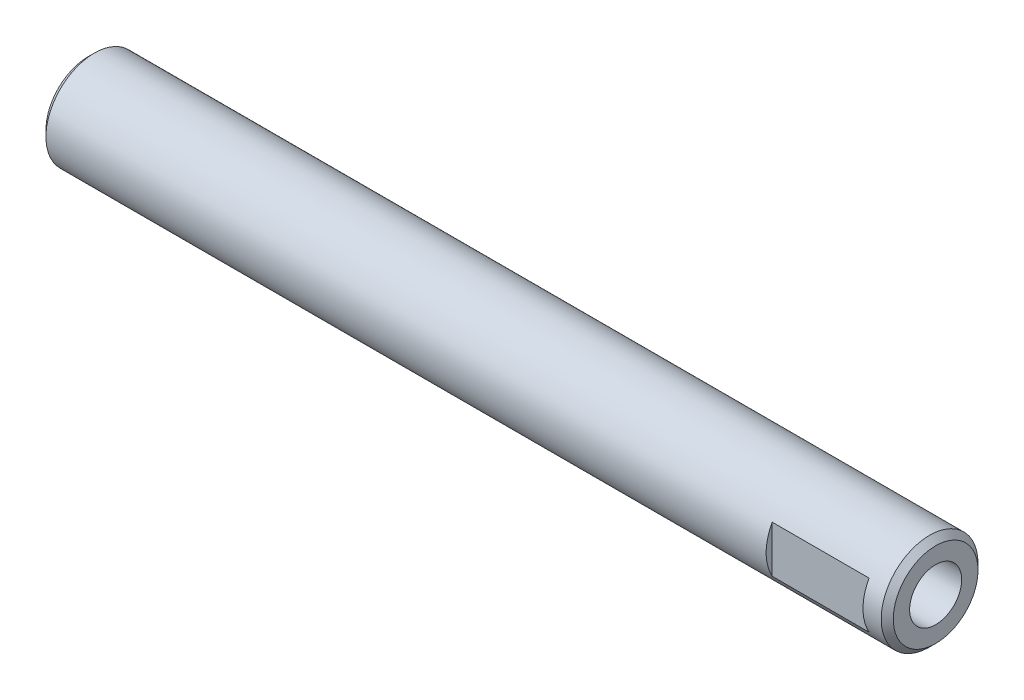
ISO-10303-21;
HEADER;
FILE_DESCRIPTION(('STEP AP214'),'2;1');
FILE_NAME('part.step','',(''),(''),'','','');
FILE_SCHEMA(('AUTOMOTIVE_DESIGN { 1 0 10303 214 1 1 1 1 }'));
ENDSEC;
DATA;
#1=APPLICATION_CONTEXT('core data for automotive mechanical design processes');
#2=APPLICATION_PROTOCOL_DEFINITION('international standard','automotive_design',2000,#1);
#3=PRODUCT_CONTEXT('',#1,'mechanical');
#4=PRODUCT('Part','Part','',(#3));
#5=PRODUCT_RELATED_PRODUCT_CATEGORY('part','',(#4));
#6=PRODUCT_DEFINITION_FORMATION('','',#4);
#7=PRODUCT_DEFINITION_CONTEXT('part definition',#1,'design');
#8=PRODUCT_DEFINITION('design','',#6,#7);
#9=PRODUCT_DEFINITION_SHAPE('','',#8);
#10=(LENGTH_UNIT() NAMED_UNIT(*) SI_UNIT(.MILLI.,.METRE.));
#11=(NAMED_UNIT(*) PLANE_ANGLE_UNIT() SI_UNIT($,.RADIAN.));
#12=(NAMED_UNIT(*) SI_UNIT($,.STERADIAN.) SOLID_ANGLE_UNIT());
#13=UNCERTAINTY_MEASURE_WITH_UNIT(LENGTH_MEASURE(1.E-05),#10,'distance_accuracy_value','');
#14=(GEOMETRIC_REPRESENTATION_CONTEXT(3) GLOBAL_UNCERTAINTY_ASSIGNED_CONTEXT((#13)) GLOBAL_UNIT_ASSIGNED_CONTEXT((#10,
#11,#12)) REPRESENTATION_CONTEXT('',''));
#15=CARTESIAN_POINT('',(0.,0.,0.));
#16=DIRECTION('',(0.,0.,1.));
#17=DIRECTION('',(1.,0.,0.));
#18=AXIS2_PLACEMENT_3D('',#15,#16,#17);
#19=CARTESIAN_POINT('',(0.,0.,0.));
#20=DIRECTION('',(-1.,0.,0.));
#21=DIRECTION('',(0.,0.,1.));
#22=AXIS2_PLACEMENT_3D('',#19,#20,#21);
#23=CYLINDRICAL_SURFACE('',#22,4.);
#24=CARTESIAN_POINT('',(34.5,0.,0.));
#25=DIRECTION('',(1.,0.,0.));
#26=DIRECTION('',(0.,0.,-1.));
#27=AXIS2_PLACEMENT_3D('',#24,#25,#26);
#28=CIRCLE('',#27,4.);
#29=CARTESIAN_POINT('',(34.5,0.,-4.));
#30=VERTEX_POINT('',#29);
#31=EDGE_CURVE('E163',#30,#30,#28,.F.);
#32=ORIENTED_EDGE('',*,*,#31,.T.);
#33=EDGE_LOOP('',(#32));
#34=FACE_BOUND('',#33,.T.);
#35=CARTESIAN_POINT('',(-34.5,0.,0.));
#36=DIRECTION('',(1.,0.,0.));
#37=DIRECTION('',(0.,0.,-1.));
#38=AXIS2_PLACEMENT_3D('',#35,#36,#37);
#39=CIRCLE('',#38,4.);
#40=CARTESIAN_POINT('',(-34.5,0.,-4.));
#41=VERTEX_POINT('',#40);
#42=EDGE_CURVE('E160',#41,#41,#39,.T.);
#43=ORIENTED_EDGE('',*,*,#42,.T.);
#44=EDGE_LOOP('',(#43));
#45=FACE_BOUND('',#44,.T.);
#46=CARTESIAN_POINT('',(25.,0.,0.));
#47=DIRECTION('',(-1.,0.,0.));
#48=DIRECTION('',(0.,0.,1.));
#49=AXIS2_PLACEMENT_3D('',#46,#47,#48);
#50=CIRCLE('',#49,4.);
#51=CARTESIAN_POINT('',(25.,-1.93649167310371,-3.5));
#52=VERTEX_POINT('',#51);
#53=CARTESIAN_POINT('',(25.,1.93649167310371,-3.5));
#54=VERTEX_POINT('',#53);
#55=EDGE_CURVE('E108',#52,#54,#50,.F.);
#56=ORIENTED_EDGE('',*,*,#55,.F.);
#57=DIRECTION('',(-1.,0.,0.));
#58=VECTOR('',#57,1.);
#59=CARTESIAN_POINT('',(0.,-1.93649167310371,-3.5));
#60=LINE('',#59,#58);
#61=CARTESIAN_POINT('',(33.,-1.93649167310371,-3.5));
#62=VERTEX_POINT('',#61);
#63=EDGE_CURVE('E95',#52,#62,#60,.F.);
#64=ORIENTED_EDGE('',*,*,#63,.T.);
#65=CARTESIAN_POINT('',(33.,0.,0.));
#66=DIRECTION('',(-1.,0.,0.));
#67=DIRECTION('',(0.,0.,1.));
#68=AXIS2_PLACEMENT_3D('',#65,#66,#67);
#69=CIRCLE('',#68,4.);
#70=CARTESIAN_POINT('',(33.,1.93649167310371,-3.5));
#71=VERTEX_POINT('',#70);
#72=EDGE_CURVE('E104',#62,#71,#69,.F.);
#73=ORIENTED_EDGE('',*,*,#72,.T.);
#74=DIRECTION('',(-1.,0.,0.));
#75=VECTOR('',#74,1.);
#76=CARTESIAN_POINT('',(0.,1.93649167310371,-3.5));
#77=LINE('',#76,#75);
#78=EDGE_CURVE('E114',#71,#54,#77,.T.);
#79=ORIENTED_EDGE('',*,*,#78,.T.);
#80=EDGE_LOOP('',(#56,#64,#73,#79));
#81=FACE_BOUND('',#80,.T.);
#82=CARTESIAN_POINT('',(25.,1.93649167310371,3.5));
#83=VERTEX_POINT('',#82);
#84=CARTESIAN_POINT('',(25.,-1.93649167310371,3.5));
#85=VERTEX_POINT('',#84);
#86=EDGE_CURVE('E117',#83,#85,#50,.F.);
#87=ORIENTED_EDGE('',*,*,#86,.F.);
#88=DIRECTION('',(-1.,0.,0.));
#89=VECTOR('',#88,1.);
#90=CARTESIAN_POINT('',(0.,1.93649167310371,3.5));
#91=LINE('',#90,#89);
#92=CARTESIAN_POINT('',(33.,1.93649167310371,3.5));
#93=VERTEX_POINT('',#92);
#94=EDGE_CURVE('E12',#83,#93,#91,.F.);
#95=ORIENTED_EDGE('',*,*,#94,.T.);
#96=CARTESIAN_POINT('',(33.,-1.93649167310371,3.5));
#97=VERTEX_POINT('',#96);
#98=EDGE_CURVE('E57',#93,#97,#69,.F.);
#99=ORIENTED_EDGE('',*,*,#98,.T.);
#100=DIRECTION('',(-1.,0.,0.));
#101=VECTOR('',#100,1.);
#102=CARTESIAN_POINT('',(0.,-1.93649167310371,3.5));
#103=LINE('',#102,#101);
#104=EDGE_CURVE('E103',#97,#85,#103,.T.);
#105=ORIENTED_EDGE('',*,*,#104,.T.);
#106=EDGE_LOOP('',(#87,#95,#99,#105));
#107=FACE_BOUND('',#106,.T.);
#108=ADVANCED_FACE('F48',(#34,#45,#81,#107),#23,.T.);
#109=CARTESIAN_POINT('',(25.,0.,0.));
#110=DIRECTION('',(1.,0.,0.));
#111=DIRECTION('',(0.,0.,-1.));
#112=AXIS2_PLACEMENT_3D('',#109,#110,#111);
#113=CONICAL_SURFACE('',#112,2.15,1.02974425867665);
#114=CARTESIAN_POINT('',(23.7081496690907,0.,0.));
#115=VERTEX_POINT('',#114);
#116=VERTEX_LOOP('',#115);
#117=FACE_BOUND('',#116,.T.);
#118=CARTESIAN_POINT('',(25.,0.,0.));
#119=DIRECTION('',(-1.,0.,0.));
#120=DIRECTION('',(0.,0.,1.));
#121=AXIS2_PLACEMENT_3D('',#118,#119,#120);
#122=CIRCLE('',#121,2.15);
#123=CARTESIAN_POINT('',(25.,0.,2.15));
#124=VERTEX_POINT('',#123);
#125=EDGE_CURVE('E156',#124,#124,#122,.T.);
#126=ORIENTED_EDGE('',*,*,#125,.F.);
#127=EDGE_LOOP('',(#126));
#128=FACE_BOUND('',#127,.T.);
#129=ADVANCED_FACE('F188',(#117,#128),#113,.F.);
#130=CARTESIAN_POINT('',(0.,0.,0.));
#131=DIRECTION('',(-1.,0.,0.));
#132=DIRECTION('',(0.,0.,1.));
#133=AXIS2_PLACEMENT_3D('',#130,#131,#132);
#134=CYLINDRICAL_SURFACE('',#133,2.15);
#135=ORIENTED_EDGE('',*,*,#125,.T.);
#136=EDGE_LOOP('',(#135));
#137=FACE_BOUND('',#136,.T.);
#138=CARTESIAN_POINT('',(35.,0.,0.));
#139=DIRECTION('',(-1.,0.,0.));
#140=DIRECTION('',(0.,0.,1.));
#141=AXIS2_PLACEMENT_3D('',#138,#139,#140);
#142=CIRCLE('',#141,2.15);
#143=CARTESIAN_POINT('',(35.,0.,2.15));
#144=VERTEX_POINT('',#143);
#145=EDGE_CURVE('E152',#144,#144,#142,.T.);
#146=ORIENTED_EDGE('',*,*,#145,.F.);
#147=EDGE_LOOP('',(#146));
#148=FACE_BOUND('',#147,.T.);
#149=ADVANCED_FACE('F193',(#137,#148),#134,.F.);
#150=CARTESIAN_POINT('',(35.,0.,0.));
#151=DIRECTION('',(1.,0.,0.));
#152=DIRECTION('',(0.,0.,-1.));
#153=AXIS2_PLACEMENT_3D('',#150,#151,#152);
#154=PLANE('',#153);
#155=CARTESIAN_POINT('',(35.,0.,0.));
#156=DIRECTION('',(1.,0.,0.));
#157=DIRECTION('',(0.,0.,-1.));
#158=AXIS2_PLACEMENT_3D('',#155,#156,#157);
#159=CIRCLE('',#158,3.50000000000001);
#160=CARTESIAN_POINT('',(35.,0.,-3.50000000000001));
#161=VERTEX_POINT('',#160);
#162=EDGE_CURVE('E167',#161,#161,#159,.T.);
#163=ORIENTED_EDGE('',*,*,#162,.T.);
#164=EDGE_LOOP('',(#163));
#165=FACE_BOUND('',#164,.T.);
#166=ORIENTED_EDGE('',*,*,#145,.T.);
#167=EDGE_LOOP('',(#166));
#168=FACE_BOUND('',#167,.T.);
#169=ADVANCED_FACE('F200',(#165,#168),#154,.T.);
#170=CARTESIAN_POINT('',(-35.,0.,0.));
#171=DIRECTION('',(1.,0.,0.));
#172=DIRECTION('',(0.,0.,-1.));
#173=AXIS2_PLACEMENT_3D('',#170,#171,#172);
#174=PLANE('',#173);
#175=CARTESIAN_POINT('',(-35.,0.,0.));
#176=DIRECTION('',(1.,0.,0.));
#177=DIRECTION('',(0.,0.,-1.));
#178=AXIS2_PLACEMENT_3D('',#175,#176,#177);
#179=CIRCLE('',#178,3.49999999999999);
#180=CARTESIAN_POINT('',(-35.,0.,-3.49999999999999));
#181=VERTEX_POINT('',#180);
#182=EDGE_CURVE('E122',#181,#181,#179,.F.);
#183=ORIENTED_EDGE('',*,*,#182,.T.);
#184=EDGE_LOOP('',(#183));
#185=FACE_BOUND('',#184,.T.);
#186=CARTESIAN_POINT('',(-35.,0.,0.));
#187=DIRECTION('',(-1.,0.,0.));
#188=DIRECTION('',(0.,0.,1.));
#189=AXIS2_PLACEMENT_3D('',#186,#187,#188);
#190=CIRCLE('',#189,2.15);
#191=CARTESIAN_POINT('',(-35.,0.,2.15));
#192=VERTEX_POINT('',#191);
#193=EDGE_CURVE('E149',#192,#192,#190,.T.);
#194=ORIENTED_EDGE('',*,*,#193,.F.);
#195=EDGE_LOOP('',(#194));
#196=FACE_BOUND('',#195,.T.);
#197=ADVANCED_FACE('F174',(#185,#196),#174,.F.);
#198=CARTESIAN_POINT('',(0.,0.,0.));
#199=DIRECTION('',(-1.,0.,0.));
#200=DIRECTION('',(0.,0.,1.));
#201=AXIS2_PLACEMENT_3D('',#198,#199,#200);
#202=CYLINDRICAL_SURFACE('',#201,2.15);
#203=CARTESIAN_POINT('',(-25.,0.,0.));
#204=DIRECTION('',(-1.,0.,0.));
#205=DIRECTION('',(0.,0.,1.));
#206=AXIS2_PLACEMENT_3D('',#203,#204,#205);
#207=CIRCLE('',#206,2.15);
#208=CARTESIAN_POINT('',(-25.,0.,2.15));
#209=VERTEX_POINT('',#208);
#210=EDGE_CURVE('E141',#209,#209,#207,.T.);
#211=ORIENTED_EDGE('',*,*,#210,.F.);
#212=EDGE_LOOP('',(#211));
#213=FACE_BOUND('',#212,.T.);
#214=ORIENTED_EDGE('',*,*,#193,.T.);
#215=EDGE_LOOP('',(#214));
#216=FACE_BOUND('',#215,.T.);
#217=ADVANCED_FACE('F223',(#213,#216),#202,.F.);
#218=CARTESIAN_POINT('',(-25.,0.,0.));
#219=DIRECTION('',(-1.,0.,0.));
#220=DIRECTION('',(0.,0.,1.));
#221=AXIS2_PLACEMENT_3D('',#218,#219,#220);
#222=CONICAL_SURFACE('',#221,2.15,1.02974425867666);
#223=CARTESIAN_POINT('',(-23.7081496690908,0.,0.));
#224=VERTEX_POINT('',#223);
#225=VERTEX_LOOP('',#224);
#226=FACE_BOUND('',#225,.T.);
#227=ORIENTED_EDGE('',*,*,#210,.T.);
#228=EDGE_LOOP('',(#227));
#229=FACE_BOUND('',#228,.T.);
#230=ADVANCED_FACE('F184',(#226,#229),#222,.F.);
#231=CARTESIAN_POINT('',(34.5,0.,0.));
#232=DIRECTION('',(-1.,0.,0.));
#233=DIRECTION('',(0.,0.,1.));
#234=AXIS2_PLACEMENT_3D('',#231,#232,#233);
#235=CONICAL_SURFACE('',#234,4.,0.785398163397452);
#236=ORIENTED_EDGE('',*,*,#162,.F.);
#237=EDGE_LOOP('',(#236));
#238=FACE_BOUND('',#237,.T.);
#239=ORIENTED_EDGE('',*,*,#31,.F.);
#240=EDGE_LOOP('',(#239));
#241=FACE_BOUND('',#240,.T.);
#242=ADVANCED_FACE('F178',(#238,#241),#235,.T.);
#243=CARTESIAN_POINT('',(-35.,0.,0.));
#244=DIRECTION('',(1.,0.,0.));
#245=DIRECTION('',(0.,0.,-1.));
#246=AXIS2_PLACEMENT_3D('',#243,#244,#245);
#247=CONICAL_SURFACE('',#246,3.49999999999999,0.785398163397445);
#248=ORIENTED_EDGE('',*,*,#42,.F.);
#249=EDGE_LOOP('',(#248));
#250=FACE_BOUND('',#249,.T.);
#251=ORIENTED_EDGE('',*,*,#182,.F.);
#252=EDGE_LOOP('',(#251));
#253=FACE_BOUND('',#252,.T.);
#254=ADVANCED_FACE('F50',(#250,#253),#247,.T.);
#255=CARTESIAN_POINT('',(33.,-4.,-3.5));
#256=DIRECTION('',(0.,0.,-1.));
#257=DIRECTION('',(-1.,0.,0.));
#258=AXIS2_PLACEMENT_3D('',#255,#256,#257);
#259=PLANE('',#258);
#260=DIRECTION('',(0.,-1.,0.));
#261=VECTOR('',#260,1.);
#262=CARTESIAN_POINT('',(25.,-4.,-3.5));
#263=LINE('',#262,#261);
#264=EDGE_CURVE('E72',#54,#52,#263,.T.);
#265=ORIENTED_EDGE('',*,*,#264,.F.);
#266=ORIENTED_EDGE('',*,*,#78,.F.);
#267=DIRECTION('',(0.,-1.,0.));
#268=VECTOR('',#267,1.);
#269=CARTESIAN_POINT('',(33.,-4.,-3.5));
#270=LINE('',#269,#268);
#271=EDGE_CURVE('E98',#71,#62,#270,.T.);
#272=ORIENTED_EDGE('',*,*,#271,.T.);
#273=ORIENTED_EDGE('',*,*,#63,.F.);
#274=EDGE_LOOP('',(#265,#266,#272,#273));
#275=FACE_BOUND('',#274,.T.);
#276=ADVANCED_FACE('F96',(#275),#259,.T.);
#277=CARTESIAN_POINT('',(25.,0.,0.));
#278=DIRECTION('',(-1.,0.,0.));
#279=DIRECTION('',(0.,0.,1.));
#280=AXIS2_PLACEMENT_3D('',#277,#278,#279);
#281=PLANE('',#280);
#282=ORIENTED_EDGE('',*,*,#55,.T.);
#283=ORIENTED_EDGE('',*,*,#264,.T.);
#284=EDGE_LOOP('',(#282,#283));
#285=FACE_BOUND('',#284,.T.);
#286=ADVANCED_FACE('F107',(#285),#281,.F.);
#287=CARTESIAN_POINT('',(33.,0.,0.));
#288=DIRECTION('',(-1.,0.,0.));
#289=DIRECTION('',(0.,0.,1.));
#290=AXIS2_PLACEMENT_3D('',#287,#288,#289);
#291=PLANE('',#290);
#292=ORIENTED_EDGE('',*,*,#271,.F.);
#293=ORIENTED_EDGE('',*,*,#72,.F.);
#294=EDGE_LOOP('',(#292,#293));
#295=FACE_BOUND('',#294,.T.);
#296=ADVANCED_FACE('F257',(#295),#291,.T.);
#297=DIRECTION('',(0.,1.,0.));
#298=VECTOR('',#297,1.);
#299=CARTESIAN_POINT('',(33.,-4.,3.5));
#300=LINE('',#299,#298);
#301=EDGE_CURVE('E111',#97,#93,#300,.T.);
#302=ORIENTED_EDGE('',*,*,#301,.F.);
#303=ORIENTED_EDGE('',*,*,#98,.F.);
#304=EDGE_LOOP('',(#302,#303));
#305=FACE_BOUND('',#304,.T.);
#306=ADVANCED_FACE('F136',(#305),#291,.T.);
#307=ORIENTED_EDGE('',*,*,#86,.T.);
#308=DIRECTION('',(0.,1.,0.));
#309=VECTOR('',#308,1.);
#310=CARTESIAN_POINT('',(25.,-4.,3.5));
#311=LINE('',#310,#309);
#312=EDGE_CURVE('E64',#85,#83,#311,.T.);
#313=ORIENTED_EDGE('',*,*,#312,.T.);
#314=EDGE_LOOP('',(#307,#313));
#315=FACE_BOUND('',#314,.T.);
#316=ADVANCED_FACE('F259',(#315),#281,.F.);
#317=CARTESIAN_POINT('',(33.,-4.,3.5));
#318=DIRECTION('',(0.,0.,1.));
#319=DIRECTION('',(1.,0.,0.));
#320=AXIS2_PLACEMENT_3D('',#317,#318,#319);
#321=PLANE('',#320);
#322=ORIENTED_EDGE('',*,*,#312,.F.);
#323=ORIENTED_EDGE('',*,*,#104,.F.);
#324=ORIENTED_EDGE('',*,*,#301,.T.);
#325=ORIENTED_EDGE('',*,*,#94,.F.);
#326=EDGE_LOOP('',(#322,#323,#324,#325));
#327=FACE_BOUND('',#326,.T.);
#328=ADVANCED_FACE('F134',(#327),#321,.T.);
#329=CLOSED_SHELL('',(#108,#129,#149,#169,#197,#217,#230,#242,#254,#276,#286,#296,#306,#316,#328));
#330=MANIFOLD_SOLID_BREP('B2',#329);
#331=ADVANCED_BREP_SHAPE_REPRESENTATION('',(#18,#330),#14);
#332=SHAPE_DEFINITION_REPRESENTATION(#9,#331);
ENDSEC;
END-ISO-10303-21;
